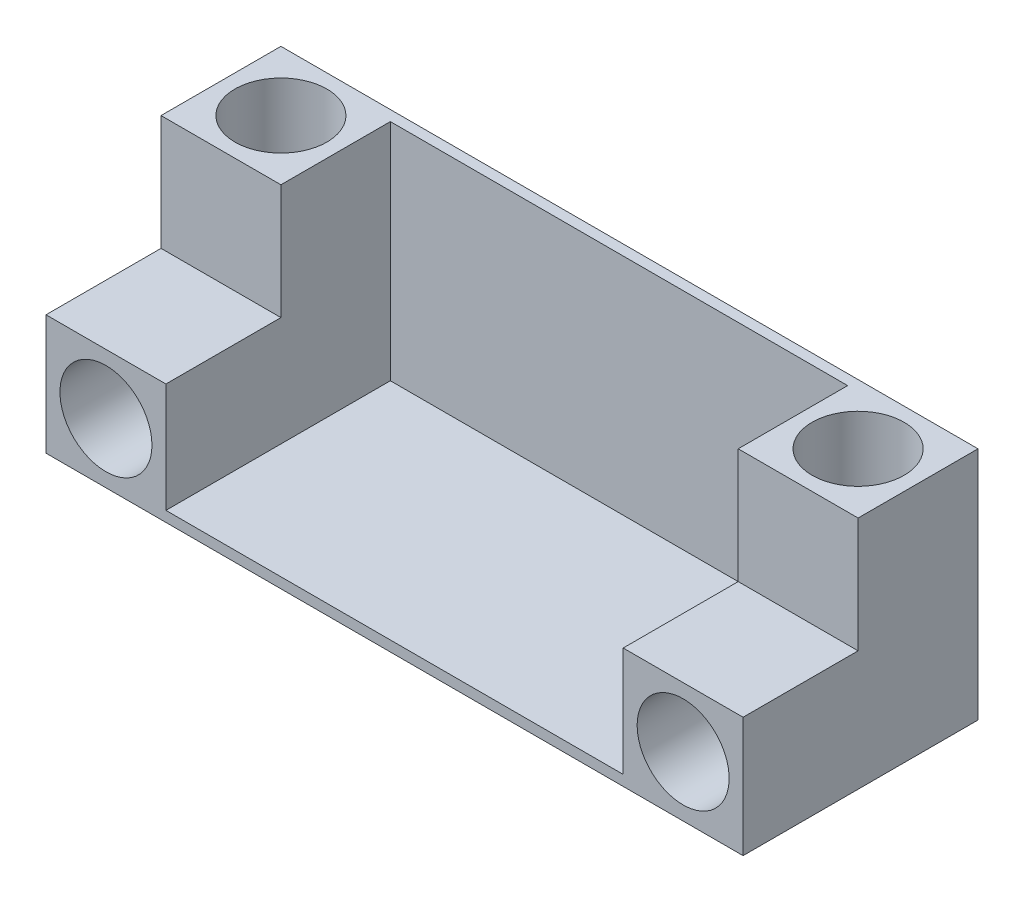
ISO-10303-21;
HEADER;
FILE_DESCRIPTION(('STEP AP214'),'2;1');
FILE_NAME('part.step','',(''),(''),'','','');
FILE_SCHEMA(('AUTOMOTIVE_DESIGN { 1 0 10303 214 1 1 1 1 }'));
ENDSEC;
DATA;
#1=APPLICATION_CONTEXT('core data for automotive mechanical design processes');
#2=APPLICATION_PROTOCOL_DEFINITION('international standard','automotive_design',2000,#1);
#3=PRODUCT_CONTEXT('',#1,'mechanical');
#4=PRODUCT('Part','Part','',(#3));
#5=PRODUCT_RELATED_PRODUCT_CATEGORY('part','',(#4));
#6=PRODUCT_DEFINITION_FORMATION('','',#4);
#7=PRODUCT_DEFINITION_CONTEXT('part definition',#1,'design');
#8=PRODUCT_DEFINITION('design','',#6,#7);
#9=PRODUCT_DEFINITION_SHAPE('','',#8);
#10=(LENGTH_UNIT() NAMED_UNIT(*) SI_UNIT(.MILLI.,.METRE.));
#11=(NAMED_UNIT(*) PLANE_ANGLE_UNIT() SI_UNIT($,.RADIAN.));
#12=(NAMED_UNIT(*) SI_UNIT($,.STERADIAN.) SOLID_ANGLE_UNIT());
#13=UNCERTAINTY_MEASURE_WITH_UNIT(LENGTH_MEASURE(1.E-05),#10,'distance_accuracy_value','');
#14=(GEOMETRIC_REPRESENTATION_CONTEXT(3) GLOBAL_UNCERTAINTY_ASSIGNED_CONTEXT((#13)) GLOBAL_UNIT_ASSIGNED_CONTEXT((#10,
#11,#12)) REPRESENTATION_CONTEXT('',''));
#15=CARTESIAN_POINT('',(0.,0.,0.));
#16=DIRECTION('',(0.,0.,1.));
#17=DIRECTION('',(1.,0.,0.));
#18=AXIS2_PLACEMENT_3D('',#15,#16,#17);
#19=CARTESIAN_POINT('',(150.,55.,0.));
#20=DIRECTION('',(-1.,0.,0.));
#21=DIRECTION('',(0.,0.,1.));
#22=AXIS2_PLACEMENT_3D('',#19,#20,#21);
#23=PLANE('',#22);
#24=DIRECTION('',(0.,-1.,0.));
#25=VECTOR('',#24,1.);
#26=CARTESIAN_POINT('',(150.,55.,6.89999999999988));
#27=LINE('',#26,#25);
#28=CARTESIAN_POINT('',(150.,67.4,6.89999999999988));
#29=VERTEX_POINT('',#28);
#30=CARTESIAN_POINT('',(150.,34.4,6.89999999999989));
#31=VERTEX_POINT('',#30);
#32=EDGE_CURVE('E176',#29,#31,#27,.T.);
#33=ORIENTED_EDGE('',*,*,#32,.T.);
#34=DIRECTION('',(0.,0.,1.));
#35=VECTOR('',#34,1.);
#36=CARTESIAN_POINT('',(150.,34.4,27.4999999999999));
#37=LINE('',#36,#35);
#38=CARTESIAN_POINT('',(150.,34.4,39.8999999999999));
#39=VERTEX_POINT('',#38);
#40=EDGE_CURVE('E150',#31,#39,#37,.T.);
#41=ORIENTED_EDGE('',*,*,#40,.T.);
#42=DIRECTION('',(0.,-1.,0.));
#43=VECTOR('',#42,1.);
#44=CARTESIAN_POINT('',(150.,34.4,39.8999999999999));
#45=LINE('',#44,#43);
#46=CARTESIAN_POINT('',(150.,0.,39.8999999999999));
#47=VERTEX_POINT('',#46);
#48=EDGE_CURVE('E142',#39,#47,#45,.T.);
#49=ORIENTED_EDGE('',*,*,#48,.T.);
#50=DIRECTION('',(0.,0.,-1.));
#51=VECTOR('',#50,1.);
#52=CARTESIAN_POINT('',(150.,0.,0.));
#53=LINE('',#52,#51);
#54=CARTESIAN_POINT('',(150.,0.,-27.5000000000001));
#55=VERTEX_POINT('',#54);
#56=EDGE_CURVE('E123',#47,#55,#53,.T.);
#57=ORIENTED_EDGE('',*,*,#56,.T.);
#58=DIRECTION('',(0.,-1.,0.));
#59=VECTOR('',#58,1.);
#60=CARTESIAN_POINT('',(150.,55.,-27.5000000000001));
#61=LINE('',#60,#59);
#62=CARTESIAN_POINT('',(150.,67.4,-27.5000000000001));
#63=VERTEX_POINT('',#62);
#64=EDGE_CURVE('E132',#63,#55,#61,.T.);
#65=ORIENTED_EDGE('',*,*,#64,.F.);
#66=DIRECTION('',(0.,0.,1.));
#67=VECTOR('',#66,1.);
#68=CARTESIAN_POINT('',(150.,67.4,-27.5000000000001));
#69=LINE('',#68,#67);
#70=EDGE_CURVE('E166',#63,#29,#69,.T.);
#71=ORIENTED_EDGE('',*,*,#70,.T.);
#72=EDGE_LOOP('',(#33,#41,#49,#57,#65,#71));
#73=FACE_BOUND('',#72,.T.);
#74=ADVANCED_FACE('F35',(#73),#23,.F.);
#75=CARTESIAN_POINT('',(115.6,3.,-24.5000000000001));
#76=DIRECTION('',(-1.,0.,0.));
#77=DIRECTION('',(0.,0.,1.));
#78=AXIS2_PLACEMENT_3D('',#75,#76,#77);
#79=PLANE('',#78);
#80=DIRECTION('',(0.,0.,-1.));
#81=VECTOR('',#80,1.);
#82=CARTESIAN_POINT('',(115.6,34.4,-24.5000000000001));
#83=LINE('',#82,#81);
#84=CARTESIAN_POINT('',(115.6,34.4,39.8999999999999));
#85=VERTEX_POINT('',#84);
#86=CARTESIAN_POINT('',(115.6,34.4,6.89999999999989));
#87=VERTEX_POINT('',#86);
#88=EDGE_CURVE('E43',#85,#87,#83,.T.);
#89=ORIENTED_EDGE('',*,*,#88,.T.);
#90=DIRECTION('',(0.,1.,0.));
#91=VECTOR('',#90,1.);
#92=CARTESIAN_POINT('',(115.6,3.00000000000001,6.89999999999992));
#93=LINE('',#92,#91);
#94=CARTESIAN_POINT('',(115.6,67.4,6.89999999999992));
#95=VERTEX_POINT('',#94);
#96=EDGE_CURVE('E11',#87,#95,#93,.T.);
#97=ORIENTED_EDGE('',*,*,#96,.T.);
#98=DIRECTION('',(0.,0.,-1.));
#99=VECTOR('',#98,1.);
#100=CARTESIAN_POINT('',(115.6,67.4,6.89999999999992));
#101=LINE('',#100,#99);
#102=CARTESIAN_POINT('',(115.6,67.4,-24.5000000000001));
#103=VERTEX_POINT('',#102);
#104=EDGE_CURVE('E169',#95,#103,#101,.T.);
#105=ORIENTED_EDGE('',*,*,#104,.T.);
#106=DIRECTION('',(0.,1.,0.));
#107=VECTOR('',#106,1.);
#108=CARTESIAN_POINT('',(115.6,3.,-24.5000000000001));
#109=LINE('',#108,#107);
#110=CARTESIAN_POINT('',(115.6,3.,-24.5000000000001));
#111=VERTEX_POINT('',#110);
#112=EDGE_CURVE('E133',#111,#103,#109,.T.);
#113=ORIENTED_EDGE('',*,*,#112,.F.);
#114=DIRECTION('',(0.,0.,1.));
#115=VECTOR('',#114,1.);
#116=CARTESIAN_POINT('',(115.6,3.,-24.5000000000001));
#117=LINE('',#116,#115);
#118=CARTESIAN_POINT('',(115.6,3.,39.8999999999999));
#119=VERTEX_POINT('',#118);
#120=EDGE_CURVE('E182',#111,#119,#117,.T.);
#121=ORIENTED_EDGE('',*,*,#120,.T.);
#122=DIRECTION('',(0.,1.,0.));
#123=VECTOR('',#122,1.);
#124=CARTESIAN_POINT('',(115.6,3.,39.8999999999999));
#125=LINE('',#124,#123);
#126=EDGE_CURVE('E154',#119,#85,#125,.T.);
#127=ORIENTED_EDGE('',*,*,#126,.T.);
#128=EDGE_LOOP('',(#89,#97,#105,#113,#121,#127));
#129=FACE_BOUND('',#128,.T.);
#130=ADVANCED_FACE('F243',(#129),#79,.T.);
#131=CARTESIAN_POINT('',(0.,55.,-27.5));
#132=DIRECTION('',(0.,0.,-1.));
#133=DIRECTION('',(-1.,0.,0.));
#134=AXIS2_PLACEMENT_3D('',#131,#132,#133);
#135=PLANE('',#134);
#136=DIRECTION('',(1.,0.,0.));
#137=VECTOR('',#136,1.);
#138=CARTESIAN_POINT('',(0.,0.,-27.5));
#139=LINE('',#138,#137);
#140=CARTESIAN_POINT('',(-50.,0.,-27.5000000000001));
#141=VERTEX_POINT('',#140);
#142=EDGE_CURVE('E128',#141,#55,#139,.T.);
#143=ORIENTED_EDGE('',*,*,#142,.F.);
#144=DIRECTION('',(0.,-1.,0.));
#145=VECTOR('',#144,1.);
#146=CARTESIAN_POINT('',(-50.,55.,-27.5000000000001));
#147=LINE('',#146,#145);
#148=CARTESIAN_POINT('',(-50.,67.4,-27.5000000000001));
#149=VERTEX_POINT('',#148);
#150=EDGE_CURVE('E232',#149,#141,#147,.T.);
#151=ORIENTED_EDGE('',*,*,#150,.F.);
#152=DIRECTION('',(-1.,0.,0.));
#153=VECTOR('',#152,1.);
#154=CARTESIAN_POINT('',(50.,67.4,-27.5));
#155=LINE('',#154,#153);
#156=EDGE_CURVE('E211',#63,#149,#155,.T.);
#157=ORIENTED_EDGE('',*,*,#156,.F.);
#158=ORIENTED_EDGE('',*,*,#64,.T.);
#159=EDGE_LOOP('',(#143,#151,#157,#158));
#160=FACE_BOUND('',#159,.T.);
#161=ADVANCED_FACE('F265',(#160),#135,.T.);
#162=CARTESIAN_POINT('',(-50.,55.,0.));
#163=DIRECTION('',(-1.,0.,0.));
#164=DIRECTION('',(0.,0.,1.));
#165=AXIS2_PLACEMENT_3D('',#162,#163,#164);
#166=PLANE('',#165);
#167=DIRECTION('',(0.,0.,1.));
#168=VECTOR('',#167,1.);
#169=CARTESIAN_POINT('',(-50.,34.4,27.4999999999999));
#170=LINE('',#169,#168);
#171=CARTESIAN_POINT('',(-50.,34.4,6.89999999999994));
#172=VERTEX_POINT('',#171);
#173=CARTESIAN_POINT('',(-50.,34.4,39.8999999999999));
#174=VERTEX_POINT('',#173);
#175=EDGE_CURVE('E216',#172,#174,#170,.T.);
#176=ORIENTED_EDGE('',*,*,#175,.F.);
#177=DIRECTION('',(0.,-1.,0.));
#178=VECTOR('',#177,1.);
#179=CARTESIAN_POINT('',(-50.,55.,6.89999999999994));
#180=LINE('',#179,#178);
#181=CARTESIAN_POINT('',(-50.,67.4,6.89999999999994));
#182=VERTEX_POINT('',#181);
#183=EDGE_CURVE('E214',#182,#172,#180,.T.);
#184=ORIENTED_EDGE('',*,*,#183,.F.);
#185=DIRECTION('',(0.,0.,1.));
#186=VECTOR('',#185,1.);
#187=CARTESIAN_POINT('',(-50.,67.4,-27.5000000000001));
#188=LINE('',#187,#186);
#189=EDGE_CURVE('E199',#149,#182,#188,.T.);
#190=ORIENTED_EDGE('',*,*,#189,.F.);
#191=ORIENTED_EDGE('',*,*,#150,.T.);
#192=DIRECTION('',(0.,0.,-1.));
#193=VECTOR('',#192,1.);
#194=CARTESIAN_POINT('',(-50.,0.,0.));
#195=LINE('',#194,#193);
#196=CARTESIAN_POINT('',(-50.,0.,39.8999999999999));
#197=VERTEX_POINT('',#196);
#198=EDGE_CURVE('E230',#197,#141,#195,.T.);
#199=ORIENTED_EDGE('',*,*,#198,.F.);
#200=DIRECTION('',(0.,-1.,0.));
#201=VECTOR('',#200,1.);
#202=CARTESIAN_POINT('',(-50.,34.4,39.8999999999999));
#203=LINE('',#202,#201);
#204=EDGE_CURVE('E146',#174,#197,#203,.T.);
#205=ORIENTED_EDGE('',*,*,#204,.F.);
#206=EDGE_LOOP('',(#176,#184,#190,#191,#199,#205));
#207=FACE_BOUND('',#206,.T.);
#208=ADVANCED_FACE('F261',(#207),#166,.T.);
#209=CARTESIAN_POINT('',(0.,0.,0.));
#210=DIRECTION('',(0.,1.,0.));
#211=DIRECTION('',(0.,0.,1.));
#212=AXIS2_PLACEMENT_3D('',#209,#210,#211);
#213=PLANE('',#212);
#214=ORIENTED_EDGE('',*,*,#56,.F.);
#215=DIRECTION('',(1.,0.,0.));
#216=VECTOR('',#215,1.);
#217=CARTESIAN_POINT('',(-50.,0.,39.8999999999999));
#218=LINE('',#217,#216);
#219=EDGE_CURVE('E126',#197,#47,#218,.T.);
#220=ORIENTED_EDGE('',*,*,#219,.F.);
#221=ORIENTED_EDGE('',*,*,#198,.T.);
#222=ORIENTED_EDGE('',*,*,#142,.T.);
#223=EDGE_LOOP('',(#214,#220,#221,#222));
#224=FACE_BOUND('',#223,.T.);
#225=ADVANCED_FACE('F37',(#224),#213,.F.);
#226=CARTESIAN_POINT('',(-15.6,3.,-24.5000000000001));
#227=DIRECTION('',(-1.,0.,0.));
#228=DIRECTION('',(0.,0.,1.));
#229=AXIS2_PLACEMENT_3D('',#226,#227,#228);
#230=PLANE('',#229);
#231=DIRECTION('',(0.,-1.,0.));
#232=VECTOR('',#231,1.);
#233=CARTESIAN_POINT('',(-15.6,3.00000000000001,6.89999999999996));
#234=LINE('',#233,#232);
#235=CARTESIAN_POINT('',(-15.6,67.4,6.89999999999996));
#236=VERTEX_POINT('',#235);
#237=CARTESIAN_POINT('',(-15.6,34.4,6.89999999999996));
#238=VERTEX_POINT('',#237);
#239=EDGE_CURVE('E237',#236,#238,#234,.T.);
#240=ORIENTED_EDGE('',*,*,#239,.T.);
#241=DIRECTION('',(0.,0.,1.));
#242=VECTOR('',#241,1.);
#243=CARTESIAN_POINT('',(-15.6,34.4,-24.5000000000001));
#244=LINE('',#243,#242);
#245=CARTESIAN_POINT('',(-15.6,34.4,39.8999999999999));
#246=VERTEX_POINT('',#245);
#247=EDGE_CURVE('E240',#238,#246,#244,.T.);
#248=ORIENTED_EDGE('',*,*,#247,.T.);
#249=DIRECTION('',(0.,1.,0.));
#250=VECTOR('',#249,1.);
#251=CARTESIAN_POINT('',(-15.6,3.,39.8999999999999));
#252=LINE('',#251,#250);
#253=CARTESIAN_POINT('',(-15.6,3.,39.8999999999999));
#254=VERTEX_POINT('',#253);
#255=EDGE_CURVE('E191',#254,#246,#252,.T.);
#256=ORIENTED_EDGE('',*,*,#255,.F.);
#257=DIRECTION('',(0.,0.,1.));
#258=VECTOR('',#257,1.);
#259=CARTESIAN_POINT('',(-15.6,3.,-24.5000000000001));
#260=LINE('',#259,#258);
#261=CARTESIAN_POINT('',(-15.6,3.,-24.5000000000001));
#262=VERTEX_POINT('',#261);
#263=EDGE_CURVE('E222',#262,#254,#260,.T.);
#264=ORIENTED_EDGE('',*,*,#263,.F.);
#265=DIRECTION('',(0.,1.,0.));
#266=VECTOR('',#265,1.);
#267=CARTESIAN_POINT('',(-15.6,3.,-24.5000000000001));
#268=LINE('',#267,#266);
#269=CARTESIAN_POINT('',(-15.6,67.4,-24.5000000000001));
#270=VERTEX_POINT('',#269);
#271=EDGE_CURVE('E227',#262,#270,#268,.T.);
#272=ORIENTED_EDGE('',*,*,#271,.T.);
#273=DIRECTION('',(0.,0.,-1.));
#274=VECTOR('',#273,1.);
#275=CARTESIAN_POINT('',(-15.6,67.4,6.89999999999996));
#276=LINE('',#275,#274);
#277=EDGE_CURVE('E205',#236,#270,#276,.T.);
#278=ORIENTED_EDGE('',*,*,#277,.F.);
#279=EDGE_LOOP('',(#240,#248,#256,#264,#272,#278));
#280=FACE_BOUND('',#279,.T.);
#281=ADVANCED_FACE('F255',(#280),#230,.F.);
#282=CARTESIAN_POINT('',(-15.6,3.,-24.5000000000001));
#283=DIRECTION('',(0.,0.,-1.));
#284=DIRECTION('',(-1.,0.,0.));
#285=AXIS2_PLACEMENT_3D('',#282,#283,#284);
#286=PLANE('',#285);
#287=ORIENTED_EDGE('',*,*,#112,.T.);
#288=DIRECTION('',(1.,0.,0.));
#289=VECTOR('',#288,1.);
#290=CARTESIAN_POINT('',(-15.6,67.4,-24.5000000000001));
#291=LINE('',#290,#289);
#292=EDGE_CURVE('E208',#270,#103,#291,.T.);
#293=ORIENTED_EDGE('',*,*,#292,.F.);
#294=ORIENTED_EDGE('',*,*,#271,.F.);
#295=DIRECTION('',(-1.,0.,0.));
#296=VECTOR('',#295,1.);
#297=CARTESIAN_POINT('',(-15.6,3.,-24.5000000000001));
#298=LINE('',#297,#296);
#299=EDGE_CURVE('E224',#111,#262,#298,.T.);
#300=ORIENTED_EDGE('',*,*,#299,.F.);
#301=EDGE_LOOP('',(#287,#293,#294,#300));
#302=FACE_BOUND('',#301,.T.);
#303=ADVANCED_FACE('F314',(#302),#286,.F.);
#304=CARTESIAN_POINT('',(0.,3.,0.));
#305=DIRECTION('',(0.,1.,0.));
#306=DIRECTION('',(0.,0.,1.));
#307=AXIS2_PLACEMENT_3D('',#304,#305,#306);
#308=PLANE('',#307);
#309=ORIENTED_EDGE('',*,*,#263,.T.);
#310=DIRECTION('',(-1.,0.,0.));
#311=VECTOR('',#310,1.);
#312=CARTESIAN_POINT('',(50.,3.,39.8999999999999));
#313=LINE('',#312,#311);
#314=EDGE_CURVE('E189',#119,#254,#313,.T.);
#315=ORIENTED_EDGE('',*,*,#314,.F.);
#316=ORIENTED_EDGE('',*,*,#120,.F.);
#317=ORIENTED_EDGE('',*,*,#299,.T.);
#318=EDGE_LOOP('',(#309,#315,#316,#317));
#319=FACE_BOUND('',#318,.T.);
#320=ADVANCED_FACE('F252',(#319),#308,.T.);
#321=CARTESIAN_POINT('',(-11.,34.4,27.5));
#322=DIRECTION('',(0.,-1.,0.));
#323=DIRECTION('',(0.,0.,-1.));
#324=AXIS2_PLACEMENT_3D('',#321,#322,#323);
#325=PLANE('',#324);
#326=DIRECTION('',(-1.,0.,0.));
#327=VECTOR('',#326,1.);
#328=CARTESIAN_POINT('',(-11.,34.4,6.89999999999996));
#329=LINE('',#328,#327);
#330=EDGE_CURVE('E58',#238,#172,#329,.T.);
#331=ORIENTED_EDGE('',*,*,#330,.T.);
#332=ORIENTED_EDGE('',*,*,#175,.T.);
#333=DIRECTION('',(-1.,0.,0.));
#334=VECTOR('',#333,1.);
#335=CARTESIAN_POINT('',(-15.6,34.4,39.8999999999999));
#336=LINE('',#335,#334);
#337=EDGE_CURVE('E194',#246,#174,#336,.T.);
#338=ORIENTED_EDGE('',*,*,#337,.F.);
#339=ORIENTED_EDGE('',*,*,#247,.F.);
#340=EDGE_LOOP('',(#331,#332,#338,#339));
#341=FACE_BOUND('',#340,.T.);
#342=ADVANCED_FACE('F258',(#341),#325,.F.);
#343=CARTESIAN_POINT('',(-11.,55.,6.89999999999996));
#344=DIRECTION('',(0.,0.,-1.));
#345=DIRECTION('',(-1.,0.,0.));
#346=AXIS2_PLACEMENT_3D('',#343,#344,#345);
#347=PLANE('',#346);
#348=ORIENTED_EDGE('',*,*,#239,.F.);
#349=DIRECTION('',(1.,0.,0.));
#350=VECTOR('',#349,1.);
#351=CARTESIAN_POINT('',(-50.,67.4,6.89999999999994));
#352=LINE('',#351,#350);
#353=EDGE_CURVE('E202',#182,#236,#352,.T.);
#354=ORIENTED_EDGE('',*,*,#353,.F.);
#355=ORIENTED_EDGE('',*,*,#183,.T.);
#356=ORIENTED_EDGE('',*,*,#330,.F.);
#357=EDGE_LOOP('',(#348,#354,#355,#356));
#358=FACE_BOUND('',#357,.T.);
#359=ADVANCED_FACE('F301',(#358),#347,.F.);
#360=CARTESIAN_POINT('',(0.,67.4,0.));
#361=DIRECTION('',(0.,1.,0.));
#362=DIRECTION('',(0.,0.,1.));
#363=AXIS2_PLACEMENT_3D('',#360,#361,#362);
#364=PLANE('',#363);
#365=ORIENTED_EDGE('',*,*,#189,.T.);
#366=ORIENTED_EDGE('',*,*,#353,.T.);
#367=ORIENTED_EDGE('',*,*,#277,.T.);
#368=ORIENTED_EDGE('',*,*,#292,.T.);
#369=ORIENTED_EDGE('',*,*,#104,.F.);
#370=DIRECTION('',(-1.,0.,0.));
#371=VECTOR('',#370,1.);
#372=CARTESIAN_POINT('',(150.,67.4,6.89999999999988));
#373=LINE('',#372,#371);
#374=EDGE_CURVE('E172',#29,#95,#373,.T.);
#375=ORIENTED_EDGE('',*,*,#374,.F.);
#376=ORIENTED_EDGE('',*,*,#70,.F.);
#377=ORIENTED_EDGE('',*,*,#156,.T.);
#378=EDGE_LOOP('',(#365,#366,#367,#368,#369,#375,#376,#377));
#379=FACE_BOUND('',#378,.T.);
#380=CARTESIAN_POINT('',(-32.8,67.4,-10.3000000000001));
#381=DIRECTION('',(0.,1.,0.));
#382=DIRECTION('',(0.,0.,1.));
#383=AXIS2_PLACEMENT_3D('',#380,#381,#382);
#384=CIRCLE('',#383,13.2);
#385=CARTESIAN_POINT('',(-32.8,67.4,2.89999999999995));
#386=VERTEX_POINT('',#385);
#387=EDGE_CURVE('E147',#386,#386,#384,.T.);
#388=ORIENTED_EDGE('',*,*,#387,.F.);
#389=EDGE_LOOP('',(#388));
#390=FACE_BOUND('',#389,.T.);
#391=CARTESIAN_POINT('',(132.8,67.4,-10.3000000000001));
#392=DIRECTION('',(0.,-1.,0.));
#393=DIRECTION('',(0.,0.,1.));
#394=AXIS2_PLACEMENT_3D('',#391,#392,#393);
#395=CIRCLE('',#394,13.2);
#396=CARTESIAN_POINT('',(132.8,67.4,2.8999999999999));
#397=VERTEX_POINT('',#396);
#398=EDGE_CURVE('E163',#397,#397,#395,.T.);
#399=ORIENTED_EDGE('',*,*,#398,.T.);
#400=EDGE_LOOP('',(#399));
#401=FACE_BOUND('',#400,.T.);
#402=ADVANCED_FACE('F269',(#379,#390,#401),#364,.T.);
#403=CARTESIAN_POINT('',(0.,5.,0.));
#404=DIRECTION('',(0.,1.,0.));
#405=DIRECTION('',(0.,0.,1.));
#406=AXIS2_PLACEMENT_3D('',#403,#404,#405);
#407=PLANE('',#406);
#408=CARTESIAN_POINT('',(-32.8,5.,-10.3000000000001));
#409=DIRECTION('',(0.,1.,0.));
#410=DIRECTION('',(0.,0.,1.));
#411=AXIS2_PLACEMENT_3D('',#408,#409,#410);
#412=CIRCLE('',#411,13.2);
#413=CARTESIAN_POINT('',(-32.8,5.,2.89999999999995));
#414=VERTEX_POINT('',#413);
#415=EDGE_CURVE('E234',#414,#414,#412,.F.);
#416=ORIENTED_EDGE('',*,*,#415,.F.);
#417=EDGE_LOOP('',(#416));
#418=FACE_BOUND('',#417,.T.);
#419=ADVANCED_FACE('F300',(#418),#407,.T.);
#420=CARTESIAN_POINT('',(-32.8,55.,-10.3000000000001));
#421=DIRECTION('',(0.,-1.,0.));
#422=DIRECTION('',(0.,0.,-1.));
#423=AXIS2_PLACEMENT_3D('',#420,#421,#422);
#424=CYLINDRICAL_SURFACE('',#423,13.2);
#425=ORIENTED_EDGE('',*,*,#415,.T.);
#426=EDGE_LOOP('',(#425));
#427=FACE_BOUND('',#426,.T.);
#428=ORIENTED_EDGE('',*,*,#387,.T.);
#429=EDGE_LOOP('',(#428));
#430=FACE_BOUND('',#429,.T.);
#431=ADVANCED_FACE('F297',(#427,#430),#424,.F.);
#432=CARTESIAN_POINT('',(0.,0.,39.8999999999999));
#433=DIRECTION('',(0.,0.,-1.));
#434=DIRECTION('',(-1.,0.,0.));
#435=AXIS2_PLACEMENT_3D('',#432,#433,#434);
#436=PLANE('',#435);
#437=ORIENTED_EDGE('',*,*,#314,.T.);
#438=ORIENTED_EDGE('',*,*,#255,.T.);
#439=ORIENTED_EDGE('',*,*,#337,.T.);
#440=ORIENTED_EDGE('',*,*,#204,.T.);
#441=ORIENTED_EDGE('',*,*,#219,.T.);
#442=ORIENTED_EDGE('',*,*,#48,.F.);
#443=DIRECTION('',(1.,0.,0.));
#444=VECTOR('',#443,1.);
#445=CARTESIAN_POINT('',(115.6,34.4,39.8999999999999));
#446=LINE('',#445,#444);
#447=EDGE_CURVE('E151',#85,#39,#446,.T.);
#448=ORIENTED_EDGE('',*,*,#447,.F.);
#449=ORIENTED_EDGE('',*,*,#126,.F.);
#450=EDGE_LOOP('',(#437,#438,#439,#440,#441,#442,#448,#449));
#451=FACE_BOUND('',#450,.T.);
#452=CARTESIAN_POINT('',(-32.801538643648,17.198461356352,39.8999999999999));
#453=DIRECTION('',(0.,0.,1.));
#454=DIRECTION('',(1.,0.,0.));
#455=AXIS2_PLACEMENT_3D('',#452,#453,#454);
#456=CIRCLE('',#455,13.2);
#457=CARTESIAN_POINT('',(-19.601538643648,17.198461356352,39.8999999999999));
#458=VERTEX_POINT('',#457);
#459=EDGE_CURVE('E186',#458,#458,#456,.T.);
#460=ORIENTED_EDGE('',*,*,#459,.F.);
#461=EDGE_LOOP('',(#460));
#462=FACE_BOUND('',#461,.T.);
#463=CARTESIAN_POINT('',(132.801538643648,17.198461356352,39.8999999999999));
#464=DIRECTION('',(0.,0.,-1.));
#465=DIRECTION('',(-1.,0.,0.));
#466=AXIS2_PLACEMENT_3D('',#463,#464,#465);
#467=CIRCLE('',#466,13.2);
#468=CARTESIAN_POINT('',(119.601538643648,17.198461356352,39.8999999999999));
#469=VERTEX_POINT('',#468);
#470=EDGE_CURVE('E152',#469,#469,#467,.T.);
#471=ORIENTED_EDGE('',*,*,#470,.T.);
#472=EDGE_LOOP('',(#471));
#473=FACE_BOUND('',#472,.T.);
#474=ADVANCED_FACE('F139',(#451,#462,#473),#436,.F.);
#475=CARTESIAN_POINT('',(-32.801538643648,17.198461356352,4.89999999999993));
#476=DIRECTION('',(0.,0.,1.));
#477=DIRECTION('',(1.,0.,0.));
#478=AXIS2_PLACEMENT_3D('',#475,#476,#477);
#479=PLANE('',#478);
#480=CARTESIAN_POINT('',(-32.801538643648,17.198461356352,4.89999999999993));
#481=DIRECTION('',(0.,0.,1.));
#482=DIRECTION('',(1.,0.,0.));
#483=AXIS2_PLACEMENT_3D('',#480,#481,#482);
#484=CIRCLE('',#483,13.2);
#485=CARTESIAN_POINT('',(-19.601538643648,17.198461356352,4.89999999999993));
#486=VERTEX_POINT('',#485);
#487=EDGE_CURVE('E219',#486,#486,#484,.T.);
#488=ORIENTED_EDGE('',*,*,#487,.T.);
#489=EDGE_LOOP('',(#488));
#490=FACE_BOUND('',#489,.T.);
#491=ADVANCED_FACE('F296',(#490),#479,.T.);
#492=CARTESIAN_POINT('',(-32.801538643648,17.198461356352,4.89999999999993));
#493=DIRECTION('',(0.,0.,1.));
#494=DIRECTION('',(1.,0.,0.));
#495=AXIS2_PLACEMENT_3D('',#492,#493,#494);
#496=CYLINDRICAL_SURFACE('',#495,13.2);
#497=ORIENTED_EDGE('',*,*,#487,.F.);
#498=EDGE_LOOP('',(#497));
#499=FACE_BOUND('',#498,.T.);
#500=ORIENTED_EDGE('',*,*,#459,.T.);
#501=EDGE_LOOP('',(#500));
#502=FACE_BOUND('',#501,.T.);
#503=ADVANCED_FACE('F282',(#499,#502),#496,.F.);
#504=CARTESIAN_POINT('',(132.8,55.,-10.3000000000001));
#505=DIRECTION('',(0.,-1.,0.));
#506=DIRECTION('',(0.,0.,-1.));
#507=AXIS2_PLACEMENT_3D('',#504,#505,#506);
#508=CYLINDRICAL_SURFACE('',#507,13.2);
#509=CARTESIAN_POINT('',(132.8,5.,-10.3000000000001));
#510=DIRECTION('',(0.,-1.,0.));
#511=DIRECTION('',(0.,0.,1.));
#512=AXIS2_PLACEMENT_3D('',#509,#510,#511);
#513=CIRCLE('',#512,13.2);
#514=CARTESIAN_POINT('',(132.8,5.,2.8999999999999));
#515=VERTEX_POINT('',#514);
#516=EDGE_CURVE('E157',#515,#515,#513,.T.);
#517=ORIENTED_EDGE('',*,*,#516,.T.);
#518=EDGE_LOOP('',(#517));
#519=FACE_BOUND('',#518,.T.);
#520=ORIENTED_EDGE('',*,*,#398,.F.);
#521=EDGE_LOOP('',(#520));
#522=FACE_BOUND('',#521,.T.);
#523=ADVANCED_FACE('F274',(#519,#522),#508,.F.);
#524=CARTESIAN_POINT('',(111.,55.,6.89999999999992));
#525=DIRECTION('',(0.,0.,1.));
#526=DIRECTION('',(1.,0.,0.));
#527=AXIS2_PLACEMENT_3D('',#524,#525,#526);
#528=PLANE('',#527);
#529=DIRECTION('',(1.,0.,0.));
#530=VECTOR('',#529,1.);
#531=CARTESIAN_POINT('',(111.,34.4,6.89999999999993));
#532=LINE('',#531,#530);
#533=EDGE_CURVE('E50',#87,#31,#532,.T.);
#534=ORIENTED_EDGE('',*,*,#533,.T.);
#535=ORIENTED_EDGE('',*,*,#32,.F.);
#536=ORIENTED_EDGE('',*,*,#374,.T.);
#537=ORIENTED_EDGE('',*,*,#96,.F.);
#538=EDGE_LOOP('',(#534,#535,#536,#537));
#539=FACE_BOUND('',#538,.T.);
#540=ADVANCED_FACE('F272',(#539),#528,.T.);
#541=CARTESIAN_POINT('',(111.,34.4,27.4999999999999));
#542=DIRECTION('',(0.,1.,0.));
#543=DIRECTION('',(0.,0.,1.));
#544=AXIS2_PLACEMENT_3D('',#541,#542,#543);
#545=PLANE('',#544);
#546=ORIENTED_EDGE('',*,*,#88,.F.);
#547=ORIENTED_EDGE('',*,*,#447,.T.);
#548=ORIENTED_EDGE('',*,*,#40,.F.);
#549=ORIENTED_EDGE('',*,*,#533,.F.);
#550=EDGE_LOOP('',(#546,#547,#548,#549));
#551=FACE_BOUND('',#550,.T.);
#552=ADVANCED_FACE('F246',(#551),#545,.T.);
#553=CARTESIAN_POINT('',(132.801538643648,17.198461356352,4.89999999999988));
#554=DIRECTION('',(0.,0.,1.));
#555=DIRECTION('',(-1.,0.,0.));
#556=AXIS2_PLACEMENT_3D('',#553,#554,#555);
#557=PLANE('',#556);
#558=CARTESIAN_POINT('',(132.801538643648,17.198461356352,4.89999999999988));
#559=DIRECTION('',(0.,0.,-1.));
#560=DIRECTION('',(-1.,0.,0.));
#561=AXIS2_PLACEMENT_3D('',#558,#559,#560);
#562=CIRCLE('',#561,13.2);
#563=CARTESIAN_POINT('',(119.601538643648,17.198461356352,4.89999999999989));
#564=VERTEX_POINT('',#563);
#565=EDGE_CURVE('E179',#564,#564,#562,.T.);
#566=ORIENTED_EDGE('',*,*,#565,.F.);
#567=EDGE_LOOP('',(#566));
#568=FACE_BOUND('',#567,.T.);
#569=ADVANCED_FACE('F280',(#568),#557,.T.);
#570=CARTESIAN_POINT('',(132.801538643648,17.198461356352,4.89999999999988));
#571=DIRECTION('',(0.,0.,1.));
#572=DIRECTION('',(1.,0.,0.));
#573=AXIS2_PLACEMENT_3D('',#570,#571,#572);
#574=CYLINDRICAL_SURFACE('',#573,13.2);
#575=ORIENTED_EDGE('',*,*,#565,.T.);
#576=EDGE_LOOP('',(#575));
#577=FACE_BOUND('',#576,.T.);
#578=ORIENTED_EDGE('',*,*,#470,.F.);
#579=EDGE_LOOP('',(#578));
#580=FACE_BOUND('',#579,.T.);
#581=ADVANCED_FACE('F378',(#577,#580),#574,.F.);
#582=CARTESIAN_POINT('',(100.,5.,0.));
#583=DIRECTION('',(0.,1.,0.));
#584=DIRECTION('',(0.,0.,1.));
#585=AXIS2_PLACEMENT_3D('',#582,#583,#584);
#586=PLANE('',#585);
#587=ORIENTED_EDGE('',*,*,#516,.F.);
#588=EDGE_LOOP('',(#587));
#589=FACE_BOUND('',#588,.T.);
#590=ADVANCED_FACE('F374',(#589),#586,.T.);
#591=CLOSED_SHELL('',(#74,#130,#161,#208,#225,#281,#303,#320,#342,#359,#402,#419,#431,#474,#491,
#503,#523,#540,#552,#569,#581,#590));
#592=MANIFOLD_SOLID_BREP('B2',#591);
#593=ADVANCED_BREP_SHAPE_REPRESENTATION('',(#18,#592),#14);
#594=SHAPE_DEFINITION_REPRESENTATION(#9,#593);
ENDSEC;
END-ISO-10303-21;
